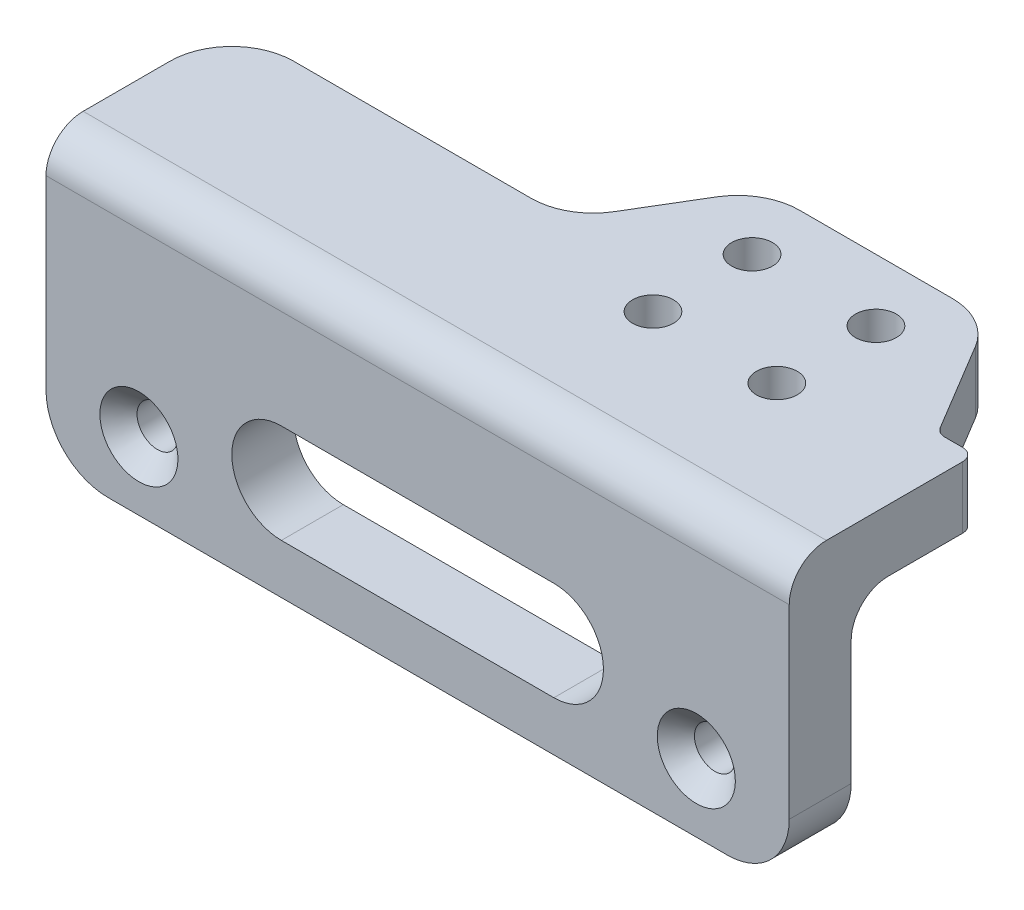
ISO-10303-21;
HEADER;
FILE_DESCRIPTION(('STEP AP214'),'2;1');
FILE_NAME('part.step','',(''),(''),'','','');
FILE_SCHEMA(('AUTOMOTIVE_DESIGN { 1 0 10303 214 1 1 1 1 }'));
ENDSEC;
DATA;
#1=APPLICATION_CONTEXT('core data for automotive mechanical design processes');
#2=APPLICATION_PROTOCOL_DEFINITION('international standard','automotive_design',2000,#1);
#3=PRODUCT_CONTEXT('',#1,'mechanical');
#4=PRODUCT('Part','Part','',(#3));
#5=PRODUCT_RELATED_PRODUCT_CATEGORY('part','',(#4));
#6=PRODUCT_DEFINITION_FORMATION('','',#4);
#7=PRODUCT_DEFINITION_CONTEXT('part definition',#1,'design');
#8=PRODUCT_DEFINITION('design','',#6,#7);
#9=PRODUCT_DEFINITION_SHAPE('','',#8);
#10=(LENGTH_UNIT() NAMED_UNIT(*) SI_UNIT(.MILLI.,.METRE.));
#11=(NAMED_UNIT(*) PLANE_ANGLE_UNIT() SI_UNIT($,.RADIAN.));
#12=(NAMED_UNIT(*) SI_UNIT($,.STERADIAN.) SOLID_ANGLE_UNIT());
#13=UNCERTAINTY_MEASURE_WITH_UNIT(LENGTH_MEASURE(1.E-05),#10,'distance_accuracy_value','');
#14=(GEOMETRIC_REPRESENTATION_CONTEXT(3) GLOBAL_UNCERTAINTY_ASSIGNED_CONTEXT((#13)) GLOBAL_UNIT_ASSIGNED_CONTEXT((#10,
#11,#12)) REPRESENTATION_CONTEXT('',''));
#15=CARTESIAN_POINT('',(0.,0.,0.));
#16=DIRECTION('',(0.,0.,1.));
#17=DIRECTION('',(1.,0.,0.));
#18=AXIS2_PLACEMENT_3D('',#15,#16,#17);
#19=CARTESIAN_POINT('',(30.,0.,0.));
#20=DIRECTION('',(0.,0.,1.));
#21=DIRECTION('',(0.,-1.,0.));
#22=AXIS2_PLACEMENT_3D('',#19,#20,#21);
#23=PLANE('',#22);
#24=DIRECTION('',(-1.,0.,0.));
#25=VECTOR('',#24,1.);
#26=CARTESIAN_POINT('',(30.,-5.99999999999999,0.));
#27=LINE('',#26,#25);
#28=CARTESIAN_POINT('',(11.,-6.,0.));
#29=VERTEX_POINT('',#28);
#30=CARTESIAN_POINT('',(-11.,-6.,0.));
#31=VERTEX_POINT('',#30);
#32=EDGE_CURVE('E225',#29,#31,#27,.T.);
#33=ORIENTED_EDGE('',*,*,#32,.T.);
#34=CARTESIAN_POINT('',(-11.,-10.,0.));
#35=DIRECTION('',(0.,0.,1.));
#36=DIRECTION('',(0.,-1.,0.));
#37=AXIS2_PLACEMENT_3D('',#34,#35,#36);
#38=CIRCLE('',#37,4.);
#39=CARTESIAN_POINT('',(-11.,-14.,0.));
#40=VERTEX_POINT('',#39);
#41=EDGE_CURVE('E217',#31,#40,#38,.T.);
#42=ORIENTED_EDGE('',*,*,#41,.T.);
#43=DIRECTION('',(1.,0.,0.));
#44=VECTOR('',#43,1.);
#45=CARTESIAN_POINT('',(30.,-14.,0.));
#46=LINE('',#45,#44);
#47=CARTESIAN_POINT('',(11.,-14.,0.));
#48=VERTEX_POINT('',#47);
#49=EDGE_CURVE('E200',#40,#48,#46,.T.);
#50=ORIENTED_EDGE('',*,*,#49,.T.);
#51=CARTESIAN_POINT('',(11.,-10.,0.));
#52=DIRECTION('',(0.,0.,1.));
#53=DIRECTION('',(0.,-1.,0.));
#54=AXIS2_PLACEMENT_3D('',#51,#52,#53);
#55=CIRCLE('',#54,4.);
#56=EDGE_CURVE('E211',#48,#29,#55,.T.);
#57=ORIENTED_EDGE('',*,*,#56,.T.);
#58=EDGE_LOOP('',(#33,#42,#50,#57));
#59=FACE_BOUND('',#58,.T.);
#60=CARTESIAN_POINT('',(22.5,-12.5,0.));
#61=DIRECTION('',(0.,0.,1.));
#62=DIRECTION('',(0.,-1.,0.));
#63=AXIS2_PLACEMENT_3D('',#60,#61,#62);
#64=CIRCLE('',#63,1.65);
#65=CARTESIAN_POINT('',(22.5,-14.15,0.));
#66=VERTEX_POINT('',#65);
#67=EDGE_CURVE('E268',#66,#66,#64,.T.);
#68=ORIENTED_EDGE('',*,*,#67,.T.);
#69=EDGE_LOOP('',(#68));
#70=FACE_BOUND('',#69,.T.);
#71=CARTESIAN_POINT('',(-22.5,-12.5,0.));
#72=DIRECTION('',(0.,0.,1.));
#73=DIRECTION('',(0.,-1.,0.));
#74=AXIS2_PLACEMENT_3D('',#71,#72,#73);
#75=CIRCLE('',#74,1.65);
#76=CARTESIAN_POINT('',(-22.5,-14.15,0.));
#77=VERTEX_POINT('',#76);
#78=EDGE_CURVE('E265',#77,#77,#75,.T.);
#79=ORIENTED_EDGE('',*,*,#78,.T.);
#80=EDGE_LOOP('',(#79));
#81=FACE_BOUND('',#80,.T.);
#82=DIRECTION('',(0.,1.,0.));
#83=VECTOR('',#82,1.);
#84=CARTESIAN_POINT('',(-30.,0.,0.));
#85=LINE('',#84,#83);
#86=CARTESIAN_POINT('',(-30.,-13.,0.));
#87=VERTEX_POINT('',#86);
#88=CARTESIAN_POINT('',(-30.,-3.,0.));
#89=VERTEX_POINT('',#88);
#90=EDGE_CURVE('E271',#87,#89,#85,.T.);
#91=ORIENTED_EDGE('',*,*,#90,.T.);
#92=DIRECTION('',(-1.,0.,0.));
#93=VECTOR('',#92,1.);
#94=CARTESIAN_POINT('',(30.,-3.,0.));
#95=LINE('',#94,#93);
#96=CARTESIAN_POINT('',(30.,-3.,0.));
#97=VERTEX_POINT('',#96);
#98=EDGE_CURVE('E372',#89,#97,#95,.F.);
#99=ORIENTED_EDGE('',*,*,#98,.T.);
#100=DIRECTION('',(0.,1.,0.));
#101=VECTOR('',#100,1.);
#102=CARTESIAN_POINT('',(30.,0.,0.));
#103=LINE('',#102,#101);
#104=CARTESIAN_POINT('',(30.,-13.,0.));
#105=VERTEX_POINT('',#104);
#106=EDGE_CURVE('E272',#105,#97,#103,.T.);
#107=ORIENTED_EDGE('',*,*,#106,.F.);
#108=CARTESIAN_POINT('',(25.,-13.,0.));
#109=DIRECTION('',(0.,0.,1.));
#110=DIRECTION('',(0.,-1.,0.));
#111=AXIS2_PLACEMENT_3D('',#108,#109,#110);
#112=CIRCLE('',#111,5.);
#113=CARTESIAN_POINT('',(25.,-18.,0.));
#114=VERTEX_POINT('',#113);
#115=EDGE_CURVE('E337',#105,#114,#112,.F.);
#116=ORIENTED_EDGE('',*,*,#115,.T.);
#117=DIRECTION('',(-1.,0.,0.));
#118=VECTOR('',#117,1.);
#119=CARTESIAN_POINT('',(30.,-18.,0.));
#120=LINE('',#119,#118);
#121=CARTESIAN_POINT('',(-25.,-18.,0.));
#122=VERTEX_POINT('',#121);
#123=EDGE_CURVE('E282',#114,#122,#120,.T.);
#124=ORIENTED_EDGE('',*,*,#123,.T.);
#125=CARTESIAN_POINT('',(-25.,-13.,0.));
#126=DIRECTION('',(0.,0.,1.));
#127=DIRECTION('',(0.,-1.,0.));
#128=AXIS2_PLACEMENT_3D('',#125,#126,#127);
#129=CIRCLE('',#128,5.);
#130=EDGE_CURVE('E335',#122,#87,#129,.F.);
#131=ORIENTED_EDGE('',*,*,#130,.T.);
#132=EDGE_LOOP('',(#91,#99,#107,#116,#124,#131));
#133=FACE_BOUND('',#132,.T.);
#134=ADVANCED_FACE('F38',(#59,#70,#81,#133),#23,.F.);
#135=CARTESIAN_POINT('',(30.,0.,0.));
#136=DIRECTION('',(0.,1.,0.));
#137=DIRECTION('',(0.,0.,1.));
#138=AXIS2_PLACEMENT_3D('',#135,#136,#137);
#139=PLANE('',#138);
#140=CARTESIAN_POINT('',(17.,0.,-15.));
#141=DIRECTION('',(0.,1.,0.));
#142=DIRECTION('',(0.,0.,1.));
#143=AXIS2_PLACEMENT_3D('',#140,#141,#142);
#144=CIRCLE('',#143,3.65);
#145=CARTESIAN_POINT('',(17.,0.,-11.35));
#146=VERTEX_POINT('',#145);
#147=EDGE_CURVE('E387',#146,#146,#144,.T.);
#148=ORIENTED_EDGE('',*,*,#147,.T.);
#149=EDGE_LOOP('',(#148));
#150=FACE_BOUND('',#149,.T.);
#151=CARTESIAN_POINT('',(17.,0.,-7.));
#152=DIRECTION('',(0.,1.,0.));
#153=DIRECTION('',(0.,0.,1.));
#154=AXIS2_PLACEMENT_3D('',#151,#152,#153);
#155=CIRCLE('',#154,3.65);
#156=CARTESIAN_POINT('',(17.,0.,-3.35));
#157=VERTEX_POINT('',#156);
#158=EDGE_CURVE('E384',#157,#157,#155,.T.);
#159=ORIENTED_EDGE('',*,*,#158,.T.);
#160=EDGE_LOOP('',(#159));
#161=FACE_BOUND('',#160,.T.);
#162=CARTESIAN_POINT('',(7.,0.,-15.));
#163=DIRECTION('',(0.,1.,0.));
#164=DIRECTION('',(0.,0.,1.));
#165=AXIS2_PLACEMENT_3D('',#162,#163,#164);
#166=CIRCLE('',#165,3.65);
#167=CARTESIAN_POINT('',(7.,0.,-11.35));
#168=VERTEX_POINT('',#167);
#169=EDGE_CURVE('E381',#168,#168,#166,.T.);
#170=ORIENTED_EDGE('',*,*,#169,.T.);
#171=EDGE_LOOP('',(#170));
#172=FACE_BOUND('',#171,.T.);
#173=CARTESIAN_POINT('',(7.,0.,-7.));
#174=DIRECTION('',(0.,1.,0.));
#175=DIRECTION('',(0.,0.,1.));
#176=AXIS2_PLACEMENT_3D('',#173,#174,#175);
#177=CIRCLE('',#176,3.65);
#178=CARTESIAN_POINT('',(7.,0.,-3.35));
#179=VERTEX_POINT('',#178);
#180=EDGE_CURVE('E378',#179,#179,#177,.T.);
#181=ORIENTED_EDGE('',*,*,#180,.T.);
#182=EDGE_LOOP('',(#181));
#183=FACE_BOUND('',#182,.T.);
#184=DIRECTION('',(1.,0.,0.));
#185=VECTOR('',#184,1.);
#186=CARTESIAN_POINT('',(30.,0.,-10.));
#187=LINE('',#186,#185);
#188=CARTESIAN_POINT('',(27.5661903789691,0.,-10.));
#189=VERTEX_POINT('',#188);
#190=CARTESIAN_POINT('',(29.,0.,-10.));
#191=VERTEX_POINT('',#190);
#192=EDGE_CURVE('E257',#189,#191,#187,.T.);
#193=ORIENTED_EDGE('',*,*,#192,.T.);
#194=CARTESIAN_POINT('',(29.,0.,-9.));
#195=DIRECTION('',(0.,1.,0.));
#196=DIRECTION('',(0.,0.,1.));
#197=AXIS2_PLACEMENT_3D('',#194,#195,#196);
#198=CIRCLE('',#197,1.);
#199=CARTESIAN_POINT('',(30.,0.,-9.));
#200=VERTEX_POINT('',#199);
#201=EDGE_CURVE('E53',#191,#200,#198,.F.);
#202=ORIENTED_EDGE('',*,*,#201,.T.);
#203=DIRECTION('',(0.,0.,-1.));
#204=VECTOR('',#203,1.);
#205=CARTESIAN_POINT('',(30.,0.,0.));
#206=LINE('',#205,#204);
#207=CARTESIAN_POINT('',(30.,0.,-3.));
#208=VERTEX_POINT('',#207);
#209=EDGE_CURVE('E275',#208,#200,#206,.T.);
#210=ORIENTED_EDGE('',*,*,#209,.F.);
#211=DIRECTION('',(-1.,0.,0.));
#212=VECTOR('',#211,1.);
#213=CARTESIAN_POINT('',(-30.,0.,-3.));
#214=LINE('',#213,#212);
#215=CARTESIAN_POINT('',(-30.,0.,-3.));
#216=VERTEX_POINT('',#215);
#217=EDGE_CURVE('E369',#208,#216,#214,.T.);
#218=ORIENTED_EDGE('',*,*,#217,.T.);
#219=DIRECTION('',(0.,0.,-1.));
#220=VECTOR('',#219,1.);
#221=CARTESIAN_POINT('',(-30.,0.,0.));
#222=LINE('',#221,#220);
#223=CARTESIAN_POINT('',(-30.,0.,-5.));
#224=VERTEX_POINT('',#223);
#225=EDGE_CURVE('E285',#216,#224,#222,.T.);
#226=ORIENTED_EDGE('',*,*,#225,.T.);
#227=CARTESIAN_POINT('',(-25.,0.,-5.));
#228=DIRECTION('',(0.,1.,0.));
#229=DIRECTION('',(0.,0.,1.));
#230=AXIS2_PLACEMENT_3D('',#227,#228,#229);
#231=CIRCLE('',#230,5.);
#232=CARTESIAN_POINT('',(-25.,0.,-10.));
#233=VERTEX_POINT('',#232);
#234=EDGE_CURVE('E323',#224,#233,#231,.F.);
#235=ORIENTED_EDGE('',*,*,#234,.T.);
#236=DIRECTION('',(1.,0.,0.));
#237=VECTOR('',#236,1.);
#238=CARTESIAN_POINT('',(30.,0.,-10.));
#239=LINE('',#238,#237);
#240=CARTESIAN_POINT('',(-5.8309518948453,0.,-10.));
#241=VERTEX_POINT('',#240);
#242=EDGE_CURVE('E254',#233,#241,#239,.T.);
#243=ORIENTED_EDGE('',*,*,#242,.T.);
#244=CARTESIAN_POINT('',(-5.8309518948453,0.,-15.));
#245=DIRECTION('',(0.,1.,0.));
#246=DIRECTION('',(0.,0.,1.));
#247=AXIS2_PLACEMENT_3D('',#244,#245,#246);
#248=CIRCLE('',#247,5.);
#249=CARTESIAN_POINT('',(-1.54348726628258,0.,-12.4275212228624));
#250=VERTEX_POINT('',#249);
#251=EDGE_CURVE('E357',#241,#250,#248,.T.);
#252=ORIENTED_EDGE('',*,*,#251,.T.);
#253=DIRECTION('',(0.514495755427526,0.,-0.857492925712544));
#254=VECTOR('',#253,1.);
#255=CARTESIAN_POINT('',(1.32352941176471,0.,-17.2058823529412));
#256=LINE('',#255,#254);
#257=CARTESIAN_POINT('',(1.54348726628258,0.,-17.5724787771376));
#258=VERTEX_POINT('',#257);
#259=EDGE_CURVE('E259',#250,#258,#256,.T.);
#260=ORIENTED_EDGE('',*,*,#259,.T.);
#261=CARTESIAN_POINT('',(5.8309518948453,0.,-15.));
#262=DIRECTION('',(0.,1.,0.));
#263=DIRECTION('',(0.,0.,1.));
#264=AXIS2_PLACEMENT_3D('',#261,#262,#263);
#265=CIRCLE('',#264,5.);
#266=CARTESIAN_POINT('',(5.8309518948453,0.,-20.));
#267=VERTEX_POINT('',#266);
#268=EDGE_CURVE('E327',#258,#267,#265,.F.);
#269=ORIENTED_EDGE('',*,*,#268,.T.);
#270=DIRECTION('',(-1.,0.,0.));
#271=VECTOR('',#270,1.);
#272=CARTESIAN_POINT('',(30.,0.,-20.));
#273=LINE('',#272,#271);
#274=CARTESIAN_POINT('',(18.1690481051547,0.,-20.));
#275=VERTEX_POINT('',#274);
#276=EDGE_CURVE('E299',#275,#267,#273,.T.);
#277=ORIENTED_EDGE('',*,*,#276,.F.);
#278=CARTESIAN_POINT('',(18.1690481051547,0.,-15.));
#279=DIRECTION('',(0.,1.,0.));
#280=DIRECTION('',(0.,0.,1.));
#281=AXIS2_PLACEMENT_3D('',#278,#279,#280);
#282=CIRCLE('',#281,5.);
#283=CARTESIAN_POINT('',(22.4565127337174,0.,-17.5724787771376));
#284=VERTEX_POINT('',#283);
#285=EDGE_CURVE('E325',#275,#284,#282,.F.);
#286=ORIENTED_EDGE('',*,*,#285,.T.);
#287=DIRECTION('',(0.514495755427526,0.,0.857492925712544));
#288=VECTOR('',#287,1.);
#289=CARTESIAN_POINT('',(32.2058823529412,0.,-1.3235294117647));
#290=LINE('',#289,#288);
#291=CARTESIAN_POINT('',(26.7086974532565,0.,-10.4855042445725));
#292=VERTEX_POINT('',#291);
#293=EDGE_CURVE('E262',#284,#292,#290,.T.);
#294=ORIENTED_EDGE('',*,*,#293,.T.);
#295=CARTESIAN_POINT('',(27.5661903789691,0.,-11.));
#296=DIRECTION('',(0.,1.,0.));
#297=DIRECTION('',(0.,0.,1.));
#298=AXIS2_PLACEMENT_3D('',#295,#296,#297);
#299=CIRCLE('',#298,1.);
#300=EDGE_CURVE('E11',#292,#189,#299,.T.);
#301=ORIENTED_EDGE('',*,*,#300,.T.);
#302=EDGE_LOOP('',(#193,#202,#210,#218,#226,#235,#243,#252,#260,#269,#277,#286,#294,#301));
#303=FACE_BOUND('',#302,.T.);
#304=ADVANCED_FACE('F448',(#150,#161,#172,#183,#303),#139,.F.);
#305=CARTESIAN_POINT('',(30.,5.,-20.));
#306=DIRECTION('',(0.,0.,1.));
#307=DIRECTION('',(1.,0.,0.));
#308=AXIS2_PLACEMENT_3D('',#305,#306,#307);
#309=PLANE('',#308);
#310=ORIENTED_EDGE('',*,*,#276,.T.);
#311=DIRECTION('',(0.,1.,0.));
#312=VECTOR('',#311,1.);
#313=CARTESIAN_POINT('',(5.8309518948453,5.,-20.));
#314=LINE('',#313,#312);
#315=CARTESIAN_POINT('',(5.8309518948453,5.,-20.));
#316=VERTEX_POINT('',#315);
#317=EDGE_CURVE('E314',#267,#316,#314,.T.);
#318=ORIENTED_EDGE('',*,*,#317,.T.);
#319=DIRECTION('',(-1.,0.,0.));
#320=VECTOR('',#319,1.);
#321=CARTESIAN_POINT('',(30.,5.,-20.));
#322=LINE('',#321,#320);
#323=CARTESIAN_POINT('',(18.1690481051547,5.,-20.));
#324=VERTEX_POINT('',#323);
#325=EDGE_CURVE('E296',#324,#316,#322,.T.);
#326=ORIENTED_EDGE('',*,*,#325,.F.);
#327=DIRECTION('',(0.,1.,0.));
#328=VECTOR('',#327,1.);
#329=CARTESIAN_POINT('',(18.1690481051547,5.,-20.));
#330=LINE('',#329,#328);
#331=EDGE_CURVE('E312',#324,#275,#330,.F.);
#332=ORIENTED_EDGE('',*,*,#331,.T.);
#333=EDGE_LOOP('',(#310,#318,#326,#332));
#334=FACE_BOUND('',#333,.T.);
#335=ADVANCED_FACE('F507',(#334),#309,.F.);
#336=CARTESIAN_POINT('',(30.,5.,5.));
#337=DIRECTION('',(0.,-1.,0.));
#338=DIRECTION('',(0.,0.,-1.));
#339=AXIS2_PLACEMENT_3D('',#336,#337,#338);
#340=PLANE('',#339);
#341=CARTESIAN_POINT('',(7.,5.,-7.));
#342=DIRECTION('',(0.,1.,0.));
#343=DIRECTION('',(0.,0.,1.));
#344=AXIS2_PLACEMENT_3D('',#341,#342,#343);
#345=CIRCLE('',#344,1.65);
#346=CARTESIAN_POINT('',(7.,5.,-5.35));
#347=VERTEX_POINT('',#346);
#348=EDGE_CURVE('E237',#347,#347,#345,.T.);
#349=ORIENTED_EDGE('',*,*,#348,.F.);
#350=EDGE_LOOP('',(#349));
#351=FACE_BOUND('',#350,.T.);
#352=CARTESIAN_POINT('',(17.,5.,-15.));
#353=DIRECTION('',(0.,1.,0.));
#354=DIRECTION('',(0.,0.,1.));
#355=AXIS2_PLACEMENT_3D('',#352,#353,#354);
#356=CIRCLE('',#355,1.65);
#357=CARTESIAN_POINT('',(17.,5.,-13.35));
#358=VERTEX_POINT('',#357);
#359=EDGE_CURVE('E229',#358,#358,#356,.T.);
#360=ORIENTED_EDGE('',*,*,#359,.F.);
#361=EDGE_LOOP('',(#360));
#362=FACE_BOUND('',#361,.T.);
#363=CARTESIAN_POINT('',(7.,5.,-15.));
#364=DIRECTION('',(0.,1.,0.));
#365=DIRECTION('',(0.,0.,1.));
#366=AXIS2_PLACEMENT_3D('',#363,#364,#365);
#367=CIRCLE('',#366,1.65);
#368=CARTESIAN_POINT('',(7.,5.,-13.35));
#369=VERTEX_POINT('',#368);
#370=EDGE_CURVE('E226',#369,#369,#367,.T.);
#371=ORIENTED_EDGE('',*,*,#370,.F.);
#372=EDGE_LOOP('',(#371));
#373=FACE_BOUND('',#372,.T.);
#374=CARTESIAN_POINT('',(17.,5.,-7.));
#375=DIRECTION('',(0.,1.,0.));
#376=DIRECTION('',(0.,0.,1.));
#377=AXIS2_PLACEMENT_3D('',#374,#375,#376);
#378=CIRCLE('',#377,1.65);
#379=CARTESIAN_POINT('',(17.,5.,-5.35));
#380=VERTEX_POINT('',#379);
#381=EDGE_CURVE('E240',#380,#380,#378,.T.);
#382=ORIENTED_EDGE('',*,*,#381,.F.);
#383=EDGE_LOOP('',(#382));
#384=FACE_BOUND('',#383,.T.);
#385=DIRECTION('',(0.,0.,1.));
#386=VECTOR('',#385,1.);
#387=CARTESIAN_POINT('',(30.,5.,5.));
#388=LINE('',#387,#386);
#389=CARTESIAN_POINT('',(30.,5.,-9.));
#390=VERTEX_POINT('',#389);
#391=CARTESIAN_POINT('',(30.,5.,2.));
#392=VERTEX_POINT('',#391);
#393=EDGE_CURVE('E278',#390,#392,#388,.T.);
#394=ORIENTED_EDGE('',*,*,#393,.F.);
#395=CARTESIAN_POINT('',(29.,5.,-9.));
#396=DIRECTION('',(0.,-1.,0.));
#397=DIRECTION('',(0.,0.,-1.));
#398=AXIS2_PLACEMENT_3D('',#395,#396,#397);
#399=CIRCLE('',#398,1.);
#400=CARTESIAN_POINT('',(29.,5.,-10.));
#401=VERTEX_POINT('',#400);
#402=EDGE_CURVE('E61',#390,#401,#399,.F.);
#403=ORIENTED_EDGE('',*,*,#402,.T.);
#404=DIRECTION('',(1.,0.,0.));
#405=VECTOR('',#404,1.);
#406=CARTESIAN_POINT('',(27.,5.,-10.));
#407=LINE('',#406,#405);
#408=CARTESIAN_POINT('',(27.5661903789691,5.,-10.));
#409=VERTEX_POINT('',#408);
#410=EDGE_CURVE('E241',#409,#401,#407,.T.);
#411=ORIENTED_EDGE('',*,*,#410,.F.);
#412=CARTESIAN_POINT('',(27.5661903789691,5.,-11.));
#413=DIRECTION('',(0.,-1.,0.));
#414=DIRECTION('',(0.,0.,-1.));
#415=AXIS2_PLACEMENT_3D('',#412,#413,#414);
#416=CIRCLE('',#415,1.);
#417=CARTESIAN_POINT('',(26.7086974532565,5.,-10.4855042445725));
#418=VERTEX_POINT('',#417);
#419=EDGE_CURVE('E46',#409,#418,#416,.T.);
#420=ORIENTED_EDGE('',*,*,#419,.T.);
#421=DIRECTION('',(0.514495755427526,0.,0.857492925712544));
#422=VECTOR('',#421,1.);
#423=CARTESIAN_POINT('',(21.,5.,-20.));
#424=LINE('',#423,#422);
#425=CARTESIAN_POINT('',(22.4565127337174,5.,-17.5724787771376));
#426=VERTEX_POINT('',#425);
#427=EDGE_CURVE('E247',#426,#418,#424,.T.);
#428=ORIENTED_EDGE('',*,*,#427,.F.);
#429=CARTESIAN_POINT('',(18.1690481051547,5.,-15.));
#430=DIRECTION('',(0.,-1.,0.));
#431=DIRECTION('',(0.,0.,-1.));
#432=AXIS2_PLACEMENT_3D('',#429,#430,#431);
#433=CIRCLE('',#432,5.);
#434=EDGE_CURVE('E319',#426,#324,#433,.F.);
#435=ORIENTED_EDGE('',*,*,#434,.T.);
#436=ORIENTED_EDGE('',*,*,#325,.T.);
#437=CARTESIAN_POINT('',(5.8309518948453,5.,-15.));
#438=DIRECTION('',(0.,-1.,0.));
#439=DIRECTION('',(0.,0.,-1.));
#440=AXIS2_PLACEMENT_3D('',#437,#438,#439);
#441=CIRCLE('',#440,5.);
#442=CARTESIAN_POINT('',(1.54348726628258,5.,-17.5724787771376));
#443=VERTEX_POINT('',#442);
#444=EDGE_CURVE('E321',#316,#443,#441,.F.);
#445=ORIENTED_EDGE('',*,*,#444,.T.);
#446=DIRECTION('',(0.514495755427526,0.,-0.857492925712544));
#447=VECTOR('',#446,1.);
#448=CARTESIAN_POINT('',(3.,5.,-20.));
#449=LINE('',#448,#447);
#450=CARTESIAN_POINT('',(-1.54348726628258,5.,-12.4275212228624));
#451=VERTEX_POINT('',#450);
#452=EDGE_CURVE('E244',#451,#443,#449,.T.);
#453=ORIENTED_EDGE('',*,*,#452,.F.);
#454=CARTESIAN_POINT('',(-5.8309518948453,5.,-15.));
#455=DIRECTION('',(0.,-1.,0.));
#456=DIRECTION('',(0.,0.,-1.));
#457=AXIS2_PLACEMENT_3D('',#454,#455,#456);
#458=CIRCLE('',#457,5.);
#459=CARTESIAN_POINT('',(-5.8309518948453,5.,-10.));
#460=VERTEX_POINT('',#459);
#461=EDGE_CURVE('E355',#451,#460,#458,.T.);
#462=ORIENTED_EDGE('',*,*,#461,.T.);
#463=DIRECTION('',(1.,0.,0.));
#464=VECTOR('',#463,1.);
#465=CARTESIAN_POINT('',(-30.,5.,-10.));
#466=LINE('',#465,#464);
#467=CARTESIAN_POINT('',(-25.,5.,-10.));
#468=VERTEX_POINT('',#467);
#469=EDGE_CURVE('E235',#468,#460,#466,.T.);
#470=ORIENTED_EDGE('',*,*,#469,.F.);
#471=CARTESIAN_POINT('',(-25.,5.,-5.));
#472=DIRECTION('',(0.,-1.,0.));
#473=DIRECTION('',(0.,0.,-1.));
#474=AXIS2_PLACEMENT_3D('',#471,#472,#473);
#475=CIRCLE('',#474,5.);
#476=CARTESIAN_POINT('',(-30.,5.,-5.));
#477=VERTEX_POINT('',#476);
#478=EDGE_CURVE('E317',#468,#477,#475,.F.);
#479=ORIENTED_EDGE('',*,*,#478,.T.);
#480=DIRECTION('',(0.,0.,1.));
#481=VECTOR('',#480,1.);
#482=CARTESIAN_POINT('',(-30.,5.,5.));
#483=LINE('',#482,#481);
#484=CARTESIAN_POINT('',(-30.,5.,2.));
#485=VERTEX_POINT('',#484);
#486=EDGE_CURVE('E287',#477,#485,#483,.T.);
#487=ORIENTED_EDGE('',*,*,#486,.T.);
#488=DIRECTION('',(-1.,0.,0.));
#489=VECTOR('',#488,1.);
#490=CARTESIAN_POINT('',(30.,5.,2.));
#491=LINE('',#490,#489);
#492=EDGE_CURVE('E364',#485,#392,#491,.F.);
#493=ORIENTED_EDGE('',*,*,#492,.T.);
#494=EDGE_LOOP('',(#394,#403,#411,#420,#428,#435,#436,#445,#453,#462,#470,#479,#487,#493));
#495=FACE_BOUND('',#494,.T.);
#496=ADVANCED_FACE('F437',(#351,#362,#373,#384,#495),#340,.F.);
#497=CARTESIAN_POINT('',(30.,-18.,5.));
#498=DIRECTION('',(0.,0.,-1.));
#499=DIRECTION('',(0.,1.,0.));
#500=AXIS2_PLACEMENT_3D('',#497,#498,#499);
#501=PLANE('',#500);
#502=DIRECTION('',(1.,0.,0.));
#503=VECTOR('',#502,1.);
#504=CARTESIAN_POINT('',(30.,-14.,5.));
#505=LINE('',#504,#503);
#506=CARTESIAN_POINT('',(11.,-14.,4.99999999999999));
#507=VERTEX_POINT('',#506);
#508=CARTESIAN_POINT('',(-11.,-14.,4.99999999999999));
#509=VERTEX_POINT('',#508);
#510=EDGE_CURVE('E414',#507,#509,#505,.F.);
#511=ORIENTED_EDGE('',*,*,#510,.T.);
#512=CARTESIAN_POINT('',(-11.,-10.,4.99999999999999));
#513=DIRECTION('',(0.,0.,1.));
#514=DIRECTION('',(1.,0.,0.));
#515=AXIS2_PLACEMENT_3D('',#512,#513,#514);
#516=CIRCLE('',#515,4.);
#517=CARTESIAN_POINT('',(-11.,-6.,4.99999999999999));
#518=VERTEX_POINT('',#517);
#519=EDGE_CURVE('E220',#509,#518,#516,.F.);
#520=ORIENTED_EDGE('',*,*,#519,.T.);
#521=DIRECTION('',(1.,0.,0.));
#522=VECTOR('',#521,1.);
#523=CARTESIAN_POINT('',(30.,-6.,5.));
#524=LINE('',#523,#522);
#525=CARTESIAN_POINT('',(11.,-6.,4.99999999999999));
#526=VERTEX_POINT('',#525);
#527=EDGE_CURVE('E419',#518,#526,#524,.T.);
#528=ORIENTED_EDGE('',*,*,#527,.T.);
#529=CARTESIAN_POINT('',(11.,-10.,4.99999999999999));
#530=DIRECTION('',(0.,0.,1.));
#531=DIRECTION('',(1.,0.,0.));
#532=AXIS2_PLACEMENT_3D('',#529,#530,#531);
#533=CIRCLE('',#532,4.);
#534=EDGE_CURVE('E416',#526,#507,#533,.F.);
#535=ORIENTED_EDGE('',*,*,#534,.T.);
#536=EDGE_LOOP('',(#511,#520,#528,#535));
#537=FACE_BOUND('',#536,.T.);
#538=CARTESIAN_POINT('',(22.5,-12.5,5.));
#539=DIRECTION('',(0.,0.,-1.));
#540=DIRECTION('',(0.,1.,0.));
#541=AXIS2_PLACEMENT_3D('',#538,#539,#540);
#542=CIRCLE('',#541,3.15000000000001);
#543=CARTESIAN_POINT('',(22.5,-9.34999999999999,5.));
#544=VERTEX_POINT('',#543);
#545=EDGE_CURVE('E408',#544,#544,#542,.T.);
#546=ORIENTED_EDGE('',*,*,#545,.T.);
#547=EDGE_LOOP('',(#546));
#548=FACE_BOUND('',#547,.T.);
#549=CARTESIAN_POINT('',(-22.5,-12.5,5.));
#550=DIRECTION('',(0.,0.,-1.));
#551=DIRECTION('',(0.,1.,0.));
#552=AXIS2_PLACEMENT_3D('',#549,#550,#551);
#553=CIRCLE('',#552,3.15000000000001);
#554=CARTESIAN_POINT('',(-22.5,-9.35,5.));
#555=VERTEX_POINT('',#554);
#556=EDGE_CURVE('E405',#555,#555,#553,.T.);
#557=ORIENTED_EDGE('',*,*,#556,.T.);
#558=EDGE_LOOP('',(#557));
#559=FACE_BOUND('',#558,.T.);
#560=DIRECTION('',(0.,-1.,0.));
#561=VECTOR('',#560,1.);
#562=CARTESIAN_POINT('',(30.,-18.,5.));
#563=LINE('',#562,#561);
#564=CARTESIAN_POINT('',(30.,2.,5.));
#565=VERTEX_POINT('',#564);
#566=CARTESIAN_POINT('',(30.,-13.,5.));
#567=VERTEX_POINT('',#566);
#568=EDGE_CURVE('E280',#565,#567,#563,.T.);
#569=ORIENTED_EDGE('',*,*,#568,.F.);
#570=DIRECTION('',(-1.,0.,0.));
#571=VECTOR('',#570,1.);
#572=CARTESIAN_POINT('',(30.,2.,5.));
#573=LINE('',#572,#571);
#574=CARTESIAN_POINT('',(-30.,2.,5.));
#575=VERTEX_POINT('',#574);
#576=EDGE_CURVE('E359',#565,#575,#573,.T.);
#577=ORIENTED_EDGE('',*,*,#576,.T.);
#578=DIRECTION('',(0.,-1.,0.));
#579=VECTOR('',#578,1.);
#580=CARTESIAN_POINT('',(-30.,-18.,5.));
#581=LINE('',#580,#579);
#582=CARTESIAN_POINT('',(-30.,-13.,5.));
#583=VERTEX_POINT('',#582);
#584=EDGE_CURVE('E276',#575,#583,#581,.T.);
#585=ORIENTED_EDGE('',*,*,#584,.T.);
#586=CARTESIAN_POINT('',(-25.,-13.,5.));
#587=DIRECTION('',(0.,0.,-1.));
#588=DIRECTION('',(0.,1.,0.));
#589=AXIS2_PLACEMENT_3D('',#586,#587,#588);
#590=CIRCLE('',#589,5.);
#591=CARTESIAN_POINT('',(-25.,-18.,5.));
#592=VERTEX_POINT('',#591);
#593=EDGE_CURVE('E344',#583,#592,#590,.F.);
#594=ORIENTED_EDGE('',*,*,#593,.T.);
#595=DIRECTION('',(-1.,0.,0.));
#596=VECTOR('',#595,1.);
#597=CARTESIAN_POINT('',(30.,-18.,5.));
#598=LINE('',#597,#596);
#599=CARTESIAN_POINT('',(25.,-18.,5.));
#600=VERTEX_POINT('',#599);
#601=EDGE_CURVE('E293',#600,#592,#598,.T.);
#602=ORIENTED_EDGE('',*,*,#601,.F.);
#603=CARTESIAN_POINT('',(25.,-13.,5.));
#604=DIRECTION('',(0.,0.,-1.));
#605=DIRECTION('',(0.,1.,0.));
#606=AXIS2_PLACEMENT_3D('',#603,#604,#605);
#607=CIRCLE('',#606,5.);
#608=EDGE_CURVE('E346',#600,#567,#607,.F.);
#609=ORIENTED_EDGE('',*,*,#608,.T.);
#610=EDGE_LOOP('',(#569,#577,#585,#594,#602,#609));
#611=FACE_BOUND('',#610,.T.);
#612=ADVANCED_FACE('F461',(#537,#548,#559,#611),#501,.F.);
#613=CARTESIAN_POINT('',(30.,-18.,0.));
#614=DIRECTION('',(0.,1.,0.));
#615=DIRECTION('',(0.,0.,1.));
#616=AXIS2_PLACEMENT_3D('',#613,#614,#615);
#617=PLANE('',#616);
#618=ORIENTED_EDGE('',*,*,#123,.F.);
#619=DIRECTION('',(0.,0.,-1.));
#620=VECTOR('',#619,1.);
#621=CARTESIAN_POINT('',(25.,-18.,0.));
#622=LINE('',#621,#620);
#623=EDGE_CURVE('E342',#114,#600,#622,.F.);
#624=ORIENTED_EDGE('',*,*,#623,.T.);
#625=ORIENTED_EDGE('',*,*,#601,.T.);
#626=DIRECTION('',(0.,0.,-1.));
#627=VECTOR('',#626,1.);
#628=CARTESIAN_POINT('',(-25.,-18.,0.));
#629=LINE('',#628,#627);
#630=EDGE_CURVE('E339',#592,#122,#629,.T.);
#631=ORIENTED_EDGE('',*,*,#630,.T.);
#632=EDGE_LOOP('',(#618,#624,#625,#631));
#633=FACE_BOUND('',#632,.T.);
#634=ADVANCED_FACE('F569',(#633),#617,.F.);
#635=CARTESIAN_POINT('',(30.,0.,0.));
#636=DIRECTION('',(-1.,0.,0.));
#637=DIRECTION('',(0.,0.,1.));
#638=AXIS2_PLACEMENT_3D('',#635,#636,#637);
#639=PLANE('',#638);
#640=ORIENTED_EDGE('',*,*,#209,.T.);
#641=DIRECTION('',(0.,1.,0.));
#642=VECTOR('',#641,1.);
#643=CARTESIAN_POINT('',(30.,0.,-9.));
#644=LINE('',#643,#642);
#645=EDGE_CURVE('E430',#200,#390,#644,.T.);
#646=ORIENTED_EDGE('',*,*,#645,.T.);
#647=ORIENTED_EDGE('',*,*,#393,.T.);
#648=CARTESIAN_POINT('',(30.,2.,2.));
#649=DIRECTION('',(-1.,0.,0.));
#650=DIRECTION('',(0.,0.,1.));
#651=AXIS2_PLACEMENT_3D('',#648,#649,#650);
#652=CIRCLE('',#651,3.);
#653=EDGE_CURVE('E367',#392,#565,#652,.F.);
#654=ORIENTED_EDGE('',*,*,#653,.T.);
#655=ORIENTED_EDGE('',*,*,#568,.T.);
#656=DIRECTION('',(0.,0.,-1.));
#657=VECTOR('',#656,1.);
#658=CARTESIAN_POINT('',(30.,-13.,0.));
#659=LINE('',#658,#657);
#660=EDGE_CURVE('E332',#567,#105,#659,.T.);
#661=ORIENTED_EDGE('',*,*,#660,.T.);
#662=ORIENTED_EDGE('',*,*,#106,.T.);
#663=CARTESIAN_POINT('',(30.,-3.,-3.));
#664=DIRECTION('',(-1.,0.,0.));
#665=DIRECTION('',(0.,0.,1.));
#666=AXIS2_PLACEMENT_3D('',#663,#664,#665);
#667=CIRCLE('',#666,3.);
#668=EDGE_CURVE('E376',#97,#208,#667,.T.);
#669=ORIENTED_EDGE('',*,*,#668,.T.);
#670=EDGE_LOOP('',(#640,#646,#647,#654,#655,#661,#662,#669));
#671=FACE_BOUND('',#670,.T.);
#672=ADVANCED_FACE('F452',(#671),#639,.F.);
#673=CARTESIAN_POINT('',(-30.,0.,0.));
#674=DIRECTION('',(-1.,0.,0.));
#675=DIRECTION('',(0.,0.,1.));
#676=AXIS2_PLACEMENT_3D('',#673,#674,#675);
#677=PLANE('',#676);
#678=ORIENTED_EDGE('',*,*,#584,.F.);
#679=CARTESIAN_POINT('',(-30.,2.,2.));
#680=DIRECTION('',(-1.,0.,0.));
#681=DIRECTION('',(0.,0.,1.));
#682=AXIS2_PLACEMENT_3D('',#679,#680,#681);
#683=CIRCLE('',#682,3.);
#684=EDGE_CURVE('E362',#575,#485,#683,.T.);
#685=ORIENTED_EDGE('',*,*,#684,.T.);
#686=ORIENTED_EDGE('',*,*,#486,.F.);
#687=DIRECTION('',(0.,1.,0.));
#688=VECTOR('',#687,1.);
#689=CARTESIAN_POINT('',(-30.,0.,-5.));
#690=LINE('',#689,#688);
#691=EDGE_CURVE('E349',#477,#224,#690,.F.);
#692=ORIENTED_EDGE('',*,*,#691,.T.);
#693=ORIENTED_EDGE('',*,*,#225,.F.);
#694=CARTESIAN_POINT('',(-30.,-3.,-3.));
#695=DIRECTION('',(-1.,0.,0.));
#696=DIRECTION('',(0.,0.,1.));
#697=AXIS2_PLACEMENT_3D('',#694,#695,#696);
#698=CIRCLE('',#697,3.);
#699=EDGE_CURVE('E374',#216,#89,#698,.F.);
#700=ORIENTED_EDGE('',*,*,#699,.T.);
#701=ORIENTED_EDGE('',*,*,#90,.F.);
#702=DIRECTION('',(0.,0.,-1.));
#703=VECTOR('',#702,1.);
#704=CARTESIAN_POINT('',(-30.,-13.,5.));
#705=LINE('',#704,#703);
#706=EDGE_CURVE('E352',#87,#583,#705,.F.);
#707=ORIENTED_EDGE('',*,*,#706,.T.);
#708=EDGE_LOOP('',(#678,#685,#686,#692,#693,#700,#701,#707));
#709=FACE_BOUND('',#708,.T.);
#710=ADVANCED_FACE('F480',(#709),#677,.T.);
#711=CARTESIAN_POINT('',(-22.5,-12.5,-20.));
#712=DIRECTION('',(0.,0.,1.));
#713=DIRECTION('',(1.,0.,0.));
#714=AXIS2_PLACEMENT_3D('',#711,#712,#713);
#715=CYLINDRICAL_SURFACE('',#714,1.65);
#716=CARTESIAN_POINT('',(-22.5,-12.5,3.5));
#717=DIRECTION('',(0.,0.,-1.));
#718=DIRECTION('',(-1.,0.,0.));
#719=AXIS2_PLACEMENT_3D('',#716,#717,#718);
#720=CIRCLE('',#719,1.65);
#721=CARTESIAN_POINT('',(-24.15,-12.5,3.5));
#722=VERTEX_POINT('',#721);
#723=EDGE_CURVE('E411',#722,#722,#720,.F.);
#724=ORIENTED_EDGE('',*,*,#723,.T.);
#725=EDGE_LOOP('',(#724));
#726=FACE_BOUND('',#725,.T.);
#727=ORIENTED_EDGE('',*,*,#78,.F.);
#728=EDGE_LOOP('',(#727));
#729=FACE_BOUND('',#728,.T.);
#730=ADVANCED_FACE('F562',(#726,#729),#715,.F.);
#731=CARTESIAN_POINT('',(22.5,-12.5,-20.));
#732=DIRECTION('',(0.,0.,1.));
#733=DIRECTION('',(1.,0.,0.));
#734=AXIS2_PLACEMENT_3D('',#731,#732,#733);
#735=CYLINDRICAL_SURFACE('',#734,1.65);
#736=CARTESIAN_POINT('',(22.5,-12.5,3.5));
#737=DIRECTION('',(0.,0.,-1.));
#738=DIRECTION('',(-1.,0.,0.));
#739=AXIS2_PLACEMENT_3D('',#736,#737,#738);
#740=CIRCLE('',#739,1.65);
#741=CARTESIAN_POINT('',(20.85,-12.5,3.5));
#742=VERTEX_POINT('',#741);
#743=EDGE_CURVE('E402',#742,#742,#740,.F.);
#744=ORIENTED_EDGE('',*,*,#743,.T.);
#745=EDGE_LOOP('',(#744));
#746=FACE_BOUND('',#745,.T.);
#747=ORIENTED_EDGE('',*,*,#67,.F.);
#748=EDGE_LOOP('',(#747));
#749=FACE_BOUND('',#748,.T.);
#750=ADVANCED_FACE('F556',(#746,#749),#735,.F.);
#751=CARTESIAN_POINT('',(-30.,-18.,-10.));
#752=DIRECTION('',(0.,0.,1.));
#753=DIRECTION('',(1.,0.,0.));
#754=AXIS2_PLACEMENT_3D('',#751,#752,#753);
#755=PLANE('',#754);
#756=ORIENTED_EDGE('',*,*,#469,.T.);
#757=DIRECTION('',(0.,1.,0.));
#758=VECTOR('',#757,1.);
#759=CARTESIAN_POINT('',(-5.8309518948453,0.,-10.));
#760=LINE('',#759,#758);
#761=EDGE_CURVE('E310',#460,#241,#760,.F.);
#762=ORIENTED_EDGE('',*,*,#761,.T.);
#763=ORIENTED_EDGE('',*,*,#242,.F.);
#764=DIRECTION('',(0.,1.,0.));
#765=VECTOR('',#764,1.);
#766=CARTESIAN_POINT('',(-25.,5.,-10.));
#767=LINE('',#766,#765);
#768=EDGE_CURVE('E307',#233,#468,#767,.T.);
#769=ORIENTED_EDGE('',*,*,#768,.T.);
#770=EDGE_LOOP('',(#756,#762,#763,#769));
#771=FACE_BOUND('',#770,.T.);
#772=ADVANCED_FACE('F489',(#771),#755,.F.);
#773=CARTESIAN_POINT('',(3.,-18.,-20.));
#774=DIRECTION('',(0.857492925712544,0.,0.514495755427526));
#775=DIRECTION('',(0.514495755427526,0.,-0.857492925712544));
#776=AXIS2_PLACEMENT_3D('',#773,#774,#775);
#777=PLANE('',#776);
#778=ORIENTED_EDGE('',*,*,#259,.F.);
#779=DIRECTION('',(0.,1.,0.));
#780=VECTOR('',#779,1.);
#781=CARTESIAN_POINT('',(-1.54348726628258,4.99999999999999,-12.4275212228624));
#782=LINE('',#781,#780);
#783=EDGE_CURVE('E304',#250,#451,#782,.T.);
#784=ORIENTED_EDGE('',*,*,#783,.T.);
#785=ORIENTED_EDGE('',*,*,#452,.T.);
#786=DIRECTION('',(0.,1.,0.));
#787=VECTOR('',#786,1.);
#788=CARTESIAN_POINT('',(1.54348726628258,-18.,-17.5724787771376));
#789=LINE('',#788,#787);
#790=EDGE_CURVE('E302',#443,#258,#789,.F.);
#791=ORIENTED_EDGE('',*,*,#790,.T.);
#792=EDGE_LOOP('',(#778,#784,#785,#791));
#793=FACE_BOUND('',#792,.T.);
#794=ADVANCED_FACE('F498',(#793),#777,.F.);
#795=CARTESIAN_POINT('',(21.,-18.,-20.));
#796=DIRECTION('',(-0.857492925712544,0.,0.514495755427526));
#797=DIRECTION('',(0.514495755427526,0.,0.857492925712544));
#798=AXIS2_PLACEMENT_3D('',#795,#796,#797);
#799=PLANE('',#798);
#800=ORIENTED_EDGE('',*,*,#427,.T.);
#801=DIRECTION('',(0.,1.,0.));
#802=VECTOR('',#801,1.);
#803=CARTESIAN_POINT('',(26.7086974532565,0.,-10.4855042445725));
#804=LINE('',#803,#802);
#805=EDGE_CURVE('E428',#418,#292,#804,.F.);
#806=ORIENTED_EDGE('',*,*,#805,.T.);
#807=ORIENTED_EDGE('',*,*,#293,.F.);
#808=DIRECTION('',(0.,1.,0.));
#809=VECTOR('',#808,1.);
#810=CARTESIAN_POINT('',(22.4565127337174,-18.,-17.5724787771376));
#811=LINE('',#810,#809);
#812=EDGE_CURVE('E329',#284,#426,#811,.T.);
#813=ORIENTED_EDGE('',*,*,#812,.T.);
#814=EDGE_LOOP('',(#800,#806,#807,#813));
#815=FACE_BOUND('',#814,.T.);
#816=ADVANCED_FACE('F442',(#815),#799,.F.);
#817=CARTESIAN_POINT('',(27.,-18.,-10.));
#818=DIRECTION('',(0.,0.,1.));
#819=DIRECTION('',(1.,0.,0.));
#820=AXIS2_PLACEMENT_3D('',#817,#818,#819);
#821=PLANE('',#820);
#822=ORIENTED_EDGE('',*,*,#192,.F.);
#823=DIRECTION('',(0.,1.,0.));
#824=VECTOR('',#823,1.);
#825=CARTESIAN_POINT('',(27.5661903789691,4.99999999999999,-10.));
#826=LINE('',#825,#824);
#827=EDGE_CURVE('E425',#189,#409,#826,.T.);
#828=ORIENTED_EDGE('',*,*,#827,.T.);
#829=ORIENTED_EDGE('',*,*,#410,.T.);
#830=DIRECTION('',(0.,1.,0.));
#831=VECTOR('',#830,1.);
#832=CARTESIAN_POINT('',(29.,-18.,-10.));
#833=LINE('',#832,#831);
#834=EDGE_CURVE('E423',#401,#191,#833,.F.);
#835=ORIENTED_EDGE('',*,*,#834,.T.);
#836=EDGE_LOOP('',(#822,#828,#829,#835));
#837=FACE_BOUND('',#836,.T.);
#838=ADVANCED_FACE('F450',(#837),#821,.F.);
#839=CARTESIAN_POINT('',(17.,-18.,-7.));
#840=DIRECTION('',(0.,1.,0.));
#841=DIRECTION('',(0.,0.,1.));
#842=AXIS2_PLACEMENT_3D('',#839,#840,#841);
#843=CYLINDRICAL_SURFACE('',#842,1.65);
#844=CARTESIAN_POINT('',(17.,2.00000000000001,-7.));
#845=DIRECTION('',(0.,1.,0.));
#846=DIRECTION('',(0.,0.,1.));
#847=AXIS2_PLACEMENT_3D('',#844,#845,#846);
#848=CIRCLE('',#847,1.65);
#849=CARTESIAN_POINT('',(17.,2.00000000000001,-5.35));
#850=VERTEX_POINT('',#849);
#851=EDGE_CURVE('E393',#850,#850,#848,.F.);
#852=ORIENTED_EDGE('',*,*,#851,.T.);
#853=EDGE_LOOP('',(#852));
#854=FACE_BOUND('',#853,.T.);
#855=ORIENTED_EDGE('',*,*,#381,.T.);
#856=EDGE_LOOP('',(#855));
#857=FACE_BOUND('',#856,.T.);
#858=ADVANCED_FACE('F549',(#854,#857),#843,.F.);
#859=CARTESIAN_POINT('',(7.,-18.,-15.));
#860=DIRECTION('',(0.,1.,0.));
#861=DIRECTION('',(0.,0.,1.));
#862=AXIS2_PLACEMENT_3D('',#859,#860,#861);
#863=CYLINDRICAL_SURFACE('',#862,1.65);
#864=CARTESIAN_POINT('',(7.,2.00000000000001,-15.));
#865=DIRECTION('',(0.,1.,0.));
#866=DIRECTION('',(0.,0.,1.));
#867=AXIS2_PLACEMENT_3D('',#864,#865,#866);
#868=CIRCLE('',#867,1.65);
#869=CARTESIAN_POINT('',(7.,2.00000000000001,-13.35));
#870=VERTEX_POINT('',#869);
#871=EDGE_CURVE('E396',#870,#870,#868,.F.);
#872=ORIENTED_EDGE('',*,*,#871,.T.);
#873=EDGE_LOOP('',(#872));
#874=FACE_BOUND('',#873,.T.);
#875=ORIENTED_EDGE('',*,*,#370,.T.);
#876=EDGE_LOOP('',(#875));
#877=FACE_BOUND('',#876,.T.);
#878=ADVANCED_FACE('F541',(#874,#877),#863,.F.);
#879=CARTESIAN_POINT('',(17.,-18.,-15.));
#880=DIRECTION('',(0.,1.,0.));
#881=DIRECTION('',(0.,0.,1.));
#882=AXIS2_PLACEMENT_3D('',#879,#880,#881);
#883=CYLINDRICAL_SURFACE('',#882,1.65);
#884=CARTESIAN_POINT('',(17.,2.00000000000001,-15.));
#885=DIRECTION('',(0.,1.,0.));
#886=DIRECTION('',(0.,0.,1.));
#887=AXIS2_PLACEMENT_3D('',#884,#885,#886);
#888=CIRCLE('',#887,1.65);
#889=CARTESIAN_POINT('',(17.,2.00000000000001,-13.35));
#890=VERTEX_POINT('',#889);
#891=EDGE_CURVE('E390',#890,#890,#888,.F.);
#892=ORIENTED_EDGE('',*,*,#891,.T.);
#893=EDGE_LOOP('',(#892));
#894=FACE_BOUND('',#893,.T.);
#895=ORIENTED_EDGE('',*,*,#359,.T.);
#896=EDGE_LOOP('',(#895));
#897=FACE_BOUND('',#896,.T.);
#898=ADVANCED_FACE('F535',(#894,#897),#883,.F.);
#899=CARTESIAN_POINT('',(7.,-18.,-7.));
#900=DIRECTION('',(0.,1.,0.));
#901=DIRECTION('',(0.,0.,1.));
#902=AXIS2_PLACEMENT_3D('',#899,#900,#901);
#903=CYLINDRICAL_SURFACE('',#902,1.65);
#904=CARTESIAN_POINT('',(7.,2.00000000000001,-7.));
#905=DIRECTION('',(0.,1.,0.));
#906=DIRECTION('',(0.,0.,1.));
#907=AXIS2_PLACEMENT_3D('',#904,#905,#906);
#908=CIRCLE('',#907,1.65);
#909=CARTESIAN_POINT('',(7.,2.00000000000001,-5.35));
#910=VERTEX_POINT('',#909);
#911=EDGE_CURVE('E399',#910,#910,#908,.F.);
#912=ORIENTED_EDGE('',*,*,#911,.T.);
#913=EDGE_LOOP('',(#912));
#914=FACE_BOUND('',#913,.T.);
#915=ORIENTED_EDGE('',*,*,#348,.T.);
#916=EDGE_LOOP('',(#915));
#917=FACE_BOUND('',#916,.T.);
#918=ADVANCED_FACE('F531',(#914,#917),#903,.F.);
#919=CARTESIAN_POINT('',(-5.8309518948453,-18.,-15.));
#920=DIRECTION('',(0.,-1.,0.));
#921=DIRECTION('',(0.,0.,-1.));
#922=AXIS2_PLACEMENT_3D('',#919,#920,#921);
#923=CYLINDRICAL_SURFACE('',#922,5.);
#924=ORIENTED_EDGE('',*,*,#251,.F.);
#925=ORIENTED_EDGE('',*,*,#761,.F.);
#926=ORIENTED_EDGE('',*,*,#461,.F.);
#927=ORIENTED_EDGE('',*,*,#783,.F.);
#928=EDGE_LOOP('',(#924,#925,#926,#927));
#929=FACE_BOUND('',#928,.T.);
#930=ADVANCED_FACE('F493',(#929),#923,.F.);
#931=CARTESIAN_POINT('',(5.8309518948453,5.,-15.));
#932=DIRECTION('',(0.,1.,0.));
#933=DIRECTION('',(0.,0.,1.));
#934=AXIS2_PLACEMENT_3D('',#931,#932,#933);
#935=CYLINDRICAL_SURFACE('',#934,5.);
#936=ORIENTED_EDGE('',*,*,#268,.F.);
#937=ORIENTED_EDGE('',*,*,#790,.F.);
#938=ORIENTED_EDGE('',*,*,#444,.F.);
#939=ORIENTED_EDGE('',*,*,#317,.F.);
#940=EDGE_LOOP('',(#936,#937,#938,#939));
#941=FACE_BOUND('',#940,.T.);
#942=ADVANCED_FACE('F502',(#941),#935,.T.);
#943=CARTESIAN_POINT('',(18.1690481051547,-18.,-15.));
#944=DIRECTION('',(0.,1.,0.));
#945=DIRECTION('',(0.,0.,1.));
#946=AXIS2_PLACEMENT_3D('',#943,#944,#945);
#947=CYLINDRICAL_SURFACE('',#946,5.);
#948=ORIENTED_EDGE('',*,*,#285,.F.);
#949=ORIENTED_EDGE('',*,*,#331,.F.);
#950=ORIENTED_EDGE('',*,*,#434,.F.);
#951=ORIENTED_EDGE('',*,*,#812,.F.);
#952=EDGE_LOOP('',(#948,#949,#950,#951));
#953=FACE_BOUND('',#952,.T.);
#954=ADVANCED_FACE('F511',(#953),#947,.T.);
#955=CARTESIAN_POINT('',(25.,-13.,0.));
#956=DIRECTION('',(0.,0.,-1.));
#957=DIRECTION('',(-1.,0.,0.));
#958=AXIS2_PLACEMENT_3D('',#955,#956,#957);
#959=CYLINDRICAL_SURFACE('',#958,5.);
#960=ORIENTED_EDGE('',*,*,#608,.F.);
#961=ORIENTED_EDGE('',*,*,#623,.F.);
#962=ORIENTED_EDGE('',*,*,#115,.F.);
#963=ORIENTED_EDGE('',*,*,#660,.F.);
#964=EDGE_LOOP('',(#960,#961,#962,#963));
#965=FACE_BOUND('',#964,.T.);
#966=ADVANCED_FACE('F468',(#965),#959,.T.);
#967=CARTESIAN_POINT('',(-25.,-13.,0.));
#968=DIRECTION('',(0.,0.,1.));
#969=DIRECTION('',(1.,0.,0.));
#970=AXIS2_PLACEMENT_3D('',#967,#968,#969);
#971=CYLINDRICAL_SURFACE('',#970,5.);
#972=ORIENTED_EDGE('',*,*,#593,.F.);
#973=ORIENTED_EDGE('',*,*,#706,.F.);
#974=ORIENTED_EDGE('',*,*,#130,.F.);
#975=ORIENTED_EDGE('',*,*,#630,.F.);
#976=EDGE_LOOP('',(#972,#973,#974,#975));
#977=FACE_BOUND('',#976,.T.);
#978=ADVANCED_FACE('F518',(#977),#971,.T.);
#979=CARTESIAN_POINT('',(-25.,-18.,-5.));
#980=DIRECTION('',(0.,-1.,0.));
#981=DIRECTION('',(0.,0.,-1.));
#982=AXIS2_PLACEMENT_3D('',#979,#980,#981);
#983=CYLINDRICAL_SURFACE('',#982,5.);
#984=ORIENTED_EDGE('',*,*,#234,.F.);
#985=ORIENTED_EDGE('',*,*,#691,.F.);
#986=ORIENTED_EDGE('',*,*,#478,.F.);
#987=ORIENTED_EDGE('',*,*,#768,.F.);
#988=EDGE_LOOP('',(#984,#985,#986,#987));
#989=FACE_BOUND('',#988,.T.);
#990=ADVANCED_FACE('F485',(#989),#983,.T.);
#991=CARTESIAN_POINT('',(30.,2.,2.));
#992=DIRECTION('',(-1.,0.,0.));
#993=DIRECTION('',(0.,0.,1.));
#994=AXIS2_PLACEMENT_3D('',#991,#992,#993);
#995=CYLINDRICAL_SURFACE('',#994,3.);
#996=ORIENTED_EDGE('',*,*,#653,.F.);
#997=ORIENTED_EDGE('',*,*,#492,.F.);
#998=ORIENTED_EDGE('',*,*,#684,.F.);
#999=ORIENTED_EDGE('',*,*,#576,.F.);
#1000=EDGE_LOOP('',(#996,#997,#998,#999));
#1001=FACE_BOUND('',#1000,.T.);
#1002=ADVANCED_FACE('F458',(#1001),#995,.T.);
#1003=CARTESIAN_POINT('',(30.,-3.,-3.));
#1004=DIRECTION('',(1.,0.,0.));
#1005=DIRECTION('',(0.,0.,-1.));
#1006=AXIS2_PLACEMENT_3D('',#1003,#1004,#1005);
#1007=CYLINDRICAL_SURFACE('',#1006,3.);
#1008=ORIENTED_EDGE('',*,*,#668,.F.);
#1009=ORIENTED_EDGE('',*,*,#98,.F.);
#1010=ORIENTED_EDGE('',*,*,#699,.F.);
#1011=ORIENTED_EDGE('',*,*,#217,.F.);
#1012=EDGE_LOOP('',(#1008,#1009,#1010,#1011));
#1013=FACE_BOUND('',#1012,.T.);
#1014=ADVANCED_FACE('F476',(#1013),#1007,.F.);
#1015=CARTESIAN_POINT('',(17.,0.,-15.));
#1016=DIRECTION('',(0.,-1.,0.));
#1017=DIRECTION('',(0.,0.,-1.));
#1018=AXIS2_PLACEMENT_3D('',#1015,#1016,#1017);
#1019=CONICAL_SURFACE('',#1018,3.65,0.785398163397446);
#1020=ORIENTED_EDGE('',*,*,#891,.F.);
#1021=EDGE_LOOP('',(#1020));
#1022=FACE_BOUND('',#1021,.T.);
#1023=ORIENTED_EDGE('',*,*,#147,.F.);
#1024=EDGE_LOOP('',(#1023));
#1025=FACE_BOUND('',#1024,.T.);
#1026=ADVANCED_FACE('F660',(#1022,#1025),#1019,.F.);
#1027=CARTESIAN_POINT('',(17.,0.,-7.));
#1028=DIRECTION('',(0.,-1.,0.));
#1029=DIRECTION('',(0.,0.,-1.));
#1030=AXIS2_PLACEMENT_3D('',#1027,#1028,#1029);
#1031=CONICAL_SURFACE('',#1030,3.65,0.785398163397447);
#1032=ORIENTED_EDGE('',*,*,#851,.F.);
#1033=EDGE_LOOP('',(#1032));
#1034=FACE_BOUND('',#1033,.T.);
#1035=ORIENTED_EDGE('',*,*,#158,.F.);
#1036=EDGE_LOOP('',(#1035));
#1037=FACE_BOUND('',#1036,.T.);
#1038=ADVANCED_FACE('F665',(#1034,#1037),#1031,.F.);
#1039=CARTESIAN_POINT('',(7.,0.,-15.));
#1040=DIRECTION('',(0.,-1.,0.));
#1041=DIRECTION('',(0.,0.,-1.));
#1042=AXIS2_PLACEMENT_3D('',#1039,#1040,#1041);
#1043=CONICAL_SURFACE('',#1042,3.65,0.785398163397447);
#1044=ORIENTED_EDGE('',*,*,#871,.F.);
#1045=EDGE_LOOP('',(#1044));
#1046=FACE_BOUND('',#1045,.T.);
#1047=ORIENTED_EDGE('',*,*,#169,.F.);
#1048=EDGE_LOOP('',(#1047));
#1049=FACE_BOUND('',#1048,.T.);
#1050=ADVANCED_FACE('F677',(#1046,#1049),#1043,.F.);
#1051=CARTESIAN_POINT('',(7.,0.,-7.));
#1052=DIRECTION('',(0.,-1.,0.));
#1053=DIRECTION('',(0.,0.,-1.));
#1054=AXIS2_PLACEMENT_3D('',#1051,#1052,#1053);
#1055=CONICAL_SURFACE('',#1054,3.65,0.785398163397447);
#1056=ORIENTED_EDGE('',*,*,#911,.F.);
#1057=EDGE_LOOP('',(#1056));
#1058=FACE_BOUND('',#1057,.T.);
#1059=ORIENTED_EDGE('',*,*,#180,.F.);
#1060=EDGE_LOOP('',(#1059));
#1061=FACE_BOUND('',#1060,.T.);
#1062=ADVANCED_FACE('F686',(#1058,#1061),#1055,.F.);
#1063=CARTESIAN_POINT('',(22.5,-12.5,3.5));
#1064=DIRECTION('',(0.,0.,1.));
#1065=DIRECTION('',(1.,0.,0.));
#1066=AXIS2_PLACEMENT_3D('',#1063,#1064,#1065);
#1067=CONICAL_SURFACE('',#1066,1.65,0.785398163397451);
#1068=ORIENTED_EDGE('',*,*,#545,.F.);
#1069=EDGE_LOOP('',(#1068));
#1070=FACE_BOUND('',#1069,.T.);
#1071=ORIENTED_EDGE('',*,*,#743,.F.);
#1072=EDGE_LOOP('',(#1071));
#1073=FACE_BOUND('',#1072,.T.);
#1074=ADVANCED_FACE('F695',(#1070,#1073),#1067,.F.);
#1075=CARTESIAN_POINT('',(-22.5,-12.5,3.5));
#1076=DIRECTION('',(0.,0.,1.));
#1077=DIRECTION('',(1.,0.,0.));
#1078=AXIS2_PLACEMENT_3D('',#1075,#1076,#1077);
#1079=CONICAL_SURFACE('',#1078,1.65,0.785398163397451);
#1080=ORIENTED_EDGE('',*,*,#556,.F.);
#1081=EDGE_LOOP('',(#1080));
#1082=FACE_BOUND('',#1081,.T.);
#1083=ORIENTED_EDGE('',*,*,#723,.F.);
#1084=EDGE_LOOP('',(#1083));
#1085=FACE_BOUND('',#1084,.T.);
#1086=ADVANCED_FACE('F705',(#1082,#1085),#1079,.F.);
#1087=CARTESIAN_POINT('',(-11.,-10.,-20.));
#1088=DIRECTION('',(0.,0.,1.));
#1089=DIRECTION('',(1.,0.,0.));
#1090=AXIS2_PLACEMENT_3D('',#1087,#1088,#1089);
#1091=CYLINDRICAL_SURFACE('',#1090,4.);
#1092=DIRECTION('',(0.,0.,1.));
#1093=VECTOR('',#1092,1.);
#1094=CARTESIAN_POINT('',(-11.,-6.,-20.));
#1095=LINE('',#1094,#1093);
#1096=EDGE_CURVE('E212',#31,#518,#1095,.T.);
#1097=ORIENTED_EDGE('',*,*,#1096,.T.);
#1098=ORIENTED_EDGE('',*,*,#519,.F.);
#1099=DIRECTION('',(0.,0.,1.));
#1100=VECTOR('',#1099,1.);
#1101=CARTESIAN_POINT('',(-11.,-14.,-20.));
#1102=LINE('',#1101,#1100);
#1103=EDGE_CURVE('E203',#40,#509,#1102,.T.);
#1104=ORIENTED_EDGE('',*,*,#1103,.F.);
#1105=ORIENTED_EDGE('',*,*,#41,.F.);
#1106=EDGE_LOOP('',(#1097,#1098,#1104,#1105));
#1107=FACE_BOUND('',#1106,.T.);
#1108=ADVANCED_FACE('F216',(#1107),#1091,.F.);
#1109=CARTESIAN_POINT('',(-11.,-6.,-20.));
#1110=DIRECTION('',(0.,1.,0.));
#1111=DIRECTION('',(-1.,0.,0.));
#1112=AXIS2_PLACEMENT_3D('',#1109,#1110,#1111);
#1113=PLANE('',#1112);
#1114=DIRECTION('',(0.,0.,1.));
#1115=VECTOR('',#1114,1.);
#1116=CARTESIAN_POINT('',(11.,-6.,-20.));
#1117=LINE('',#1116,#1115);
#1118=EDGE_CURVE('E855',#29,#526,#1117,.T.);
#1119=ORIENTED_EDGE('',*,*,#1118,.T.);
#1120=ORIENTED_EDGE('',*,*,#527,.F.);
#1121=ORIENTED_EDGE('',*,*,#1096,.F.);
#1122=ORIENTED_EDGE('',*,*,#32,.F.);
#1123=EDGE_LOOP('',(#1119,#1120,#1121,#1122));
#1124=FACE_BOUND('',#1123,.T.);
#1125=ADVANCED_FACE('F718',(#1124),#1113,.F.);
#1126=CARTESIAN_POINT('',(11.,-10.,-20.));
#1127=DIRECTION('',(0.,0.,1.));
#1128=DIRECTION('',(1.,0.,0.));
#1129=AXIS2_PLACEMENT_3D('',#1126,#1127,#1128);
#1130=CYLINDRICAL_SURFACE('',#1129,4.);
#1131=DIRECTION('',(0.,0.,1.));
#1132=VECTOR('',#1131,1.);
#1133=CARTESIAN_POINT('',(11.,-14.,-20.));
#1134=LINE('',#1133,#1132);
#1135=EDGE_CURVE('E206',#48,#507,#1134,.T.);
#1136=ORIENTED_EDGE('',*,*,#1135,.T.);
#1137=ORIENTED_EDGE('',*,*,#534,.F.);
#1138=ORIENTED_EDGE('',*,*,#1118,.F.);
#1139=ORIENTED_EDGE('',*,*,#56,.F.);
#1140=EDGE_LOOP('',(#1136,#1137,#1138,#1139));
#1141=FACE_BOUND('',#1140,.T.);
#1142=ADVANCED_FACE('F725',(#1141),#1130,.F.);
#1143=CARTESIAN_POINT('',(-11.,-14.,-20.));
#1144=DIRECTION('',(0.,-1.,0.));
#1145=DIRECTION('',(0.,0.,-1.));
#1146=AXIS2_PLACEMENT_3D('',#1143,#1144,#1145);
#1147=PLANE('',#1146);
#1148=ORIENTED_EDGE('',*,*,#1103,.T.);
#1149=ORIENTED_EDGE('',*,*,#510,.F.);
#1150=ORIENTED_EDGE('',*,*,#1135,.F.);
#1151=ORIENTED_EDGE('',*,*,#49,.F.);
#1152=EDGE_LOOP('',(#1148,#1149,#1150,#1151));
#1153=FACE_BOUND('',#1152,.T.);
#1154=ADVANCED_FACE('F202',(#1153),#1147,.F.);
#1155=CARTESIAN_POINT('',(27.5661903789691,-18.,-11.));
#1156=DIRECTION('',(0.,-1.,0.));
#1157=DIRECTION('',(0.,0.,-1.));
#1158=AXIS2_PLACEMENT_3D('',#1155,#1156,#1157);
#1159=CYLINDRICAL_SURFACE('',#1158,1.);
#1160=ORIENTED_EDGE('',*,*,#300,.F.);
#1161=ORIENTED_EDGE('',*,*,#805,.F.);
#1162=ORIENTED_EDGE('',*,*,#419,.F.);
#1163=ORIENTED_EDGE('',*,*,#827,.F.);
#1164=EDGE_LOOP('',(#1160,#1161,#1162,#1163));
#1165=FACE_BOUND('',#1164,.T.);
#1166=ADVANCED_FACE('F446',(#1165),#1159,.F.);
#1167=CARTESIAN_POINT('',(29.,0.,-9.));
#1168=DIRECTION('',(0.,1.,0.));
#1169=DIRECTION('',(0.,0.,1.));
#1170=AXIS2_PLACEMENT_3D('',#1167,#1168,#1169);
#1171=CYLINDRICAL_SURFACE('',#1170,1.);
#1172=ORIENTED_EDGE('',*,*,#201,.F.);
#1173=ORIENTED_EDGE('',*,*,#834,.F.);
#1174=ORIENTED_EDGE('',*,*,#402,.F.);
#1175=ORIENTED_EDGE('',*,*,#645,.F.);
#1176=EDGE_LOOP('',(#1172,#1173,#1174,#1175));
#1177=FACE_BOUND('',#1176,.T.);
#1178=ADVANCED_FACE('F40',(#1177),#1171,.T.);
#1179=CLOSED_SHELL('',(#134,#304,#335,#496,#612,#634,#672,#710,#730,#750,#772,#794,#816,#838,
#858,#878,#898,#918,#930,#942,#954,#966,#978,#990,#1002,#1014,#1026,#1038,#1050,#1062,#1074,
#1086,#1108,#1125,#1142,#1154,#1166,#1178));
#1180=MANIFOLD_SOLID_BREP('B2',#1179);
#1181=ADVANCED_BREP_SHAPE_REPRESENTATION('',(#18,#1180),#14);
#1182=SHAPE_DEFINITION_REPRESENTATION(#9,#1181);
ENDSEC;
END-ISO-10303-21;
